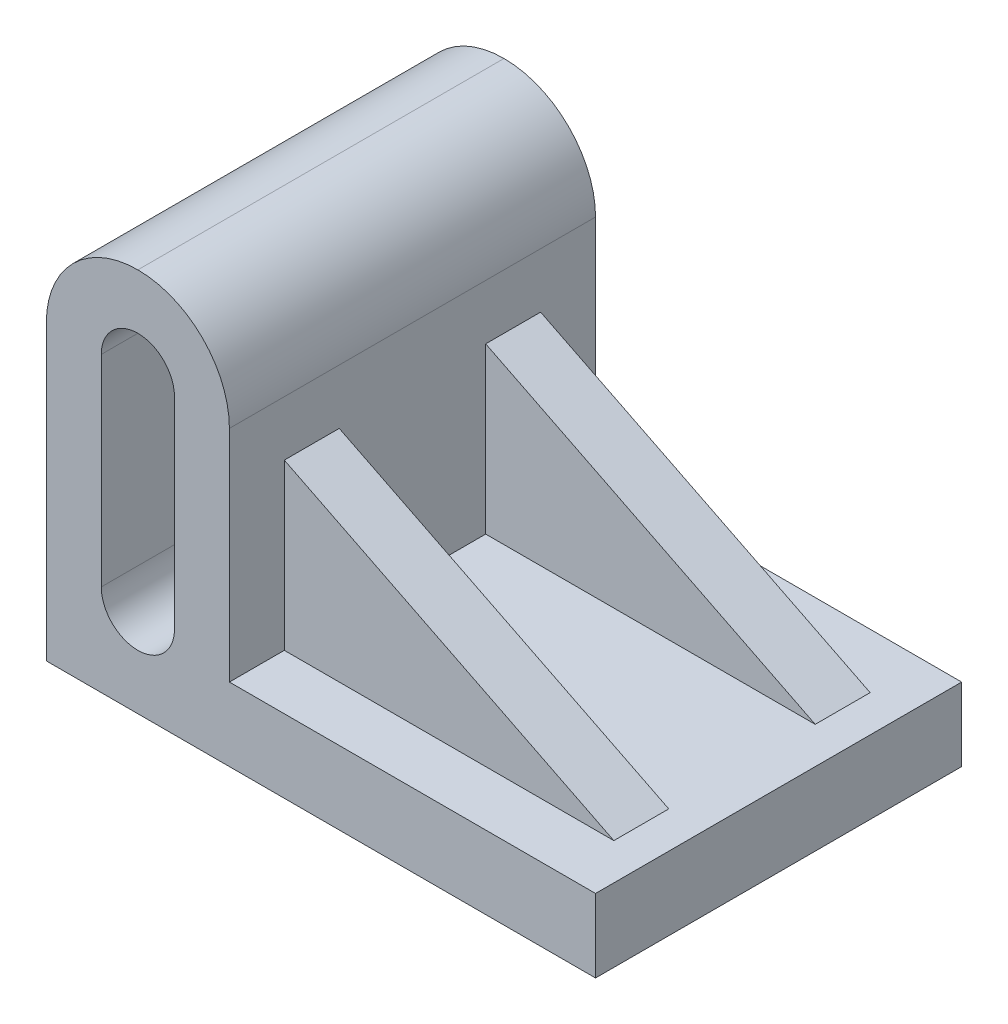
ISO-10303-21;
HEADER;
FILE_DESCRIPTION(('STEP AP214'),'2;1');
FILE_NAME('part.step','',(''),(''),'','','');
FILE_SCHEMA(('AUTOMOTIVE_DESIGN { 1 0 10303 214 1 1 1 1 }'));
ENDSEC;
DATA;
#1=APPLICATION_CONTEXT('core data for automotive mechanical design processes');
#2=APPLICATION_PROTOCOL_DEFINITION('international standard','automotive_design',2000,#1);
#3=PRODUCT_CONTEXT('',#1,'mechanical');
#4=PRODUCT('Part','Part','',(#3));
#5=PRODUCT_RELATED_PRODUCT_CATEGORY('part','',(#4));
#6=PRODUCT_DEFINITION_FORMATION('','',#4);
#7=PRODUCT_DEFINITION_CONTEXT('part definition',#1,'design');
#8=PRODUCT_DEFINITION('design','',#6,#7);
#9=PRODUCT_DEFINITION_SHAPE('','',#8);
#10=(LENGTH_UNIT() NAMED_UNIT(*) SI_UNIT(.MILLI.,.METRE.));
#11=(NAMED_UNIT(*) PLANE_ANGLE_UNIT() SI_UNIT($,.RADIAN.));
#12=(NAMED_UNIT(*) SI_UNIT($,.STERADIAN.) SOLID_ANGLE_UNIT());
#13=UNCERTAINTY_MEASURE_WITH_UNIT(LENGTH_MEASURE(1.E-05),#10,'distance_accuracy_value','');
#14=(GEOMETRIC_REPRESENTATION_CONTEXT(3) GLOBAL_UNCERTAINTY_ASSIGNED_CONTEXT((#13)) GLOBAL_UNIT_ASSIGNED_CONTEXT((#10,
#11,#12)) REPRESENTATION_CONTEXT('',''));
#15=CARTESIAN_POINT('',(0.,0.,0.));
#16=DIRECTION('',(0.,0.,1.));
#17=DIRECTION('',(1.,0.,0.));
#18=AXIS2_PLACEMENT_3D('',#15,#16,#17);
#19=CARTESIAN_POINT('',(150.,0.,-50.));
#20=DIRECTION('',(0.,-1.,0.));
#21=DIRECTION('',(0.,0.,-1.));
#22=AXIS2_PLACEMENT_3D('',#19,#20,#21);
#23=PLANE('',#22);
#24=DIRECTION('',(0.,0.,1.));
#25=VECTOR('',#24,1.);
#26=CARTESIAN_POINT('',(150.,0.,-50.));
#27=LINE('',#26,#25);
#28=CARTESIAN_POINT('',(150.,0.,-50.));
#29=VERTEX_POINT('',#28);
#30=CARTESIAN_POINT('',(150.,0.,50.));
#31=VERTEX_POINT('',#30);
#32=EDGE_CURVE('E210',#29,#31,#27,.T.);
#33=ORIENTED_EDGE('',*,*,#32,.T.);
#34=DIRECTION('',(1.,0.,0.));
#35=VECTOR('',#34,1.);
#36=CARTESIAN_POINT('',(150.,0.,50.));
#37=LINE('',#36,#35);
#38=CARTESIAN_POINT('',(0.,0.,50.));
#39=VERTEX_POINT('',#38);
#40=EDGE_CURVE('E279',#39,#31,#37,.T.);
#41=ORIENTED_EDGE('',*,*,#40,.F.);
#42=DIRECTION('',(0.,0.,1.));
#43=VECTOR('',#42,1.);
#44=CARTESIAN_POINT('',(0.,0.,-50.));
#45=LINE('',#44,#43);
#46=CARTESIAN_POINT('',(0.,0.,-50.));
#47=VERTEX_POINT('',#46);
#48=EDGE_CURVE('E193',#47,#39,#45,.T.);
#49=ORIENTED_EDGE('',*,*,#48,.F.);
#50=DIRECTION('',(1.,0.,0.));
#51=VECTOR('',#50,1.);
#52=CARTESIAN_POINT('',(150.,0.,-50.));
#53=LINE('',#52,#51);
#54=EDGE_CURVE('E264',#47,#29,#53,.T.);
#55=ORIENTED_EDGE('',*,*,#54,.T.);
#56=EDGE_LOOP('',(#33,#41,#49,#55));
#57=FACE_BOUND('',#56,.T.);
#58=ADVANCED_FACE('F45',(#57),#23,.T.);
#59=CARTESIAN_POINT('',(0.,0.,-50.));
#60=DIRECTION('',(-1.,0.,0.));
#61=DIRECTION('',(0.,0.,1.));
#62=AXIS2_PLACEMENT_3D('',#59,#60,#61);
#63=PLANE('',#62);
#64=DIRECTION('',(0.,-1.,0.));
#65=VECTOR('',#64,1.);
#66=CARTESIAN_POINT('',(0.,0.,50.));
#67=LINE('',#66,#65);
#68=CARTESIAN_POINT('',(0.,80.,50.));
#69=VERTEX_POINT('',#68);
#70=EDGE_CURVE('E268',#69,#39,#67,.T.);
#71=ORIENTED_EDGE('',*,*,#70,.F.);
#72=DIRECTION('',(0.,0.,1.));
#73=VECTOR('',#72,1.);
#74=CARTESIAN_POINT('',(0.,80.,-50.));
#75=LINE('',#74,#73);
#76=CARTESIAN_POINT('',(0.,80.,-50.));
#77=VERTEX_POINT('',#76);
#78=EDGE_CURVE('E225',#69,#77,#75,.F.);
#79=ORIENTED_EDGE('',*,*,#78,.T.);
#80=DIRECTION('',(0.,-1.,0.));
#81=VECTOR('',#80,1.);
#82=CARTESIAN_POINT('',(0.,0.,-50.));
#83=LINE('',#82,#81);
#84=EDGE_CURVE('E216',#77,#47,#83,.T.);
#85=ORIENTED_EDGE('',*,*,#84,.T.);
#86=ORIENTED_EDGE('',*,*,#48,.T.);
#87=EDGE_LOOP('',(#71,#79,#85,#86));
#88=FACE_BOUND('',#87,.T.);
#89=ADVANCED_FACE('F388',(#88),#63,.T.);
#90=CARTESIAN_POINT('',(50.,105.,-50.));
#91=DIRECTION('',(1.,0.,0.));
#92=DIRECTION('',(0.,1.,0.));
#93=AXIS2_PLACEMENT_3D('',#90,#91,#92);
#94=PLANE('',#93);
#95=DIRECTION('',(0.,1.,0.));
#96=VECTOR('',#95,1.);
#97=CARTESIAN_POINT('',(50.,20.,-35.));
#98=LINE('',#97,#96);
#99=CARTESIAN_POINT('',(50.,20.,-35.));
#100=VERTEX_POINT('',#99);
#101=CARTESIAN_POINT('',(50.,65.,-35.));
#102=VERTEX_POINT('',#101);
#103=EDGE_CURVE('E169',#100,#102,#98,.T.);
#104=ORIENTED_EDGE('',*,*,#103,.F.);
#105=DIRECTION('',(0.,0.,1.));
#106=VECTOR('',#105,1.);
#107=CARTESIAN_POINT('',(50.,20.,-50.));
#108=LINE('',#107,#106);
#109=CARTESIAN_POINT('',(50.,20.,-50.));
#110=VERTEX_POINT('',#109);
#111=EDGE_CURVE('E183',#110,#100,#108,.T.);
#112=ORIENTED_EDGE('',*,*,#111,.F.);
#113=DIRECTION('',(0.,1.,0.));
#114=VECTOR('',#113,1.);
#115=CARTESIAN_POINT('',(50.,105.,-50.));
#116=LINE('',#115,#114);
#117=CARTESIAN_POINT('',(50.,80.,-50.));
#118=VERTEX_POINT('',#117);
#119=EDGE_CURVE('E252',#110,#118,#116,.T.);
#120=ORIENTED_EDGE('',*,*,#119,.T.);
#121=DIRECTION('',(0.,0.,1.));
#122=VECTOR('',#121,1.);
#123=CARTESIAN_POINT('',(50.,80.,-50.));
#124=LINE('',#123,#122);
#125=CARTESIAN_POINT('',(50.,80.,50.));
#126=VERTEX_POINT('',#125);
#127=EDGE_CURVE('E231',#118,#126,#124,.T.);
#128=ORIENTED_EDGE('',*,*,#127,.T.);
#129=DIRECTION('',(0.,1.,0.));
#130=VECTOR('',#129,1.);
#131=CARTESIAN_POINT('',(50.,105.,50.));
#132=LINE('',#131,#130);
#133=CARTESIAN_POINT('',(50.,20.,50.));
#134=VERTEX_POINT('',#133);
#135=EDGE_CURVE('E241',#134,#126,#132,.T.);
#136=ORIENTED_EDGE('',*,*,#135,.F.);
#137=CARTESIAN_POINT('',(50.,20.,35.));
#138=VERTEX_POINT('',#137);
#139=EDGE_CURVE('E196',#138,#134,#108,.T.);
#140=ORIENTED_EDGE('',*,*,#139,.F.);
#141=DIRECTION('',(0.,-1.,0.));
#142=VECTOR('',#141,1.);
#143=CARTESIAN_POINT('',(50.,20.,35.));
#144=LINE('',#143,#142);
#145=CARTESIAN_POINT('',(50.,65.,35.));
#146=VERTEX_POINT('',#145);
#147=EDGE_CURVE('E337',#146,#138,#144,.T.);
#148=ORIENTED_EDGE('',*,*,#147,.F.);
#149=DIRECTION('',(0.,0.,-1.));
#150=VECTOR('',#149,1.);
#151=CARTESIAN_POINT('',(50.,65.,35.));
#152=LINE('',#151,#150);
#153=CARTESIAN_POINT('',(50.,65.,20.));
#154=VERTEX_POINT('',#153);
#155=EDGE_CURVE('E330',#146,#154,#152,.T.);
#156=ORIENTED_EDGE('',*,*,#155,.T.);
#157=DIRECTION('',(0.,-1.,0.));
#158=VECTOR('',#157,1.);
#159=CARTESIAN_POINT('',(50.,20.,20.));
#160=LINE('',#159,#158);
#161=CARTESIAN_POINT('',(50.,20.,20.));
#162=VERTEX_POINT('',#161);
#163=EDGE_CURVE('E342',#154,#162,#160,.T.);
#164=ORIENTED_EDGE('',*,*,#163,.T.);
#165=CARTESIAN_POINT('',(50.,20.,-20.));
#166=VERTEX_POINT('',#165);
#167=EDGE_CURVE('E194',#166,#162,#108,.T.);
#168=ORIENTED_EDGE('',*,*,#167,.F.);
#169=DIRECTION('',(0.,1.,0.));
#170=VECTOR('',#169,1.);
#171=CARTESIAN_POINT('',(50.,20.,-20.));
#172=LINE('',#171,#170);
#173=CARTESIAN_POINT('',(50.,65.,-20.));
#174=VERTEX_POINT('',#173);
#175=EDGE_CURVE('E61',#166,#174,#172,.T.);
#176=ORIENTED_EDGE('',*,*,#175,.T.);
#177=DIRECTION('',(0.,0.,1.));
#178=VECTOR('',#177,1.);
#179=CARTESIAN_POINT('',(50.,65.,-35.));
#180=LINE('',#179,#178);
#181=EDGE_CURVE('E185',#102,#174,#180,.T.);
#182=ORIENTED_EDGE('',*,*,#181,.F.);
#183=EDGE_LOOP('',(#104,#112,#120,#128,#136,#140,#148,#156,#164,#168,#176,#182));
#184=FACE_BOUND('',#183,.T.);
#185=ADVANCED_FACE('F181',(#184),#94,.T.);
#186=CARTESIAN_POINT('',(50.,20.,-50.));
#187=DIRECTION('',(0.,1.,0.));
#188=DIRECTION('',(0.,0.,1.));
#189=AXIS2_PLACEMENT_3D('',#186,#187,#188);
#190=PLANE('',#189);
#191=DIRECTION('',(-1.,0.,0.));
#192=VECTOR('',#191,1.);
#193=CARTESIAN_POINT('',(140.,20.,-35.));
#194=LINE('',#193,#192);
#195=CARTESIAN_POINT('',(140.,20.,-35.));
#196=VERTEX_POINT('',#195);
#197=EDGE_CURVE('E166',#196,#100,#194,.T.);
#198=ORIENTED_EDGE('',*,*,#197,.F.);
#199=DIRECTION('',(0.,0.,1.));
#200=VECTOR('',#199,1.);
#201=CARTESIAN_POINT('',(140.,20.,-35.));
#202=LINE('',#201,#200);
#203=CARTESIAN_POINT('',(140.,20.,-20.));
#204=VERTEX_POINT('',#203);
#205=EDGE_CURVE('E355',#196,#204,#202,.T.);
#206=ORIENTED_EDGE('',*,*,#205,.T.);
#207=DIRECTION('',(-1.,0.,0.));
#208=VECTOR('',#207,1.);
#209=CARTESIAN_POINT('',(140.,20.,-20.));
#210=LINE('',#209,#208);
#211=EDGE_CURVE('E362',#204,#166,#210,.T.);
#212=ORIENTED_EDGE('',*,*,#211,.T.);
#213=ORIENTED_EDGE('',*,*,#167,.T.);
#214=DIRECTION('',(1.,0.,0.));
#215=VECTOR('',#214,1.);
#216=CARTESIAN_POINT('',(140.,20.,20.));
#217=LINE('',#216,#215);
#218=CARTESIAN_POINT('',(140.,20.,20.));
#219=VERTEX_POINT('',#218);
#220=EDGE_CURVE('E338',#162,#219,#217,.T.);
#221=ORIENTED_EDGE('',*,*,#220,.T.);
#222=DIRECTION('',(0.,0.,-1.));
#223=VECTOR('',#222,1.);
#224=CARTESIAN_POINT('',(140.,20.,35.));
#225=LINE('',#224,#223);
#226=CARTESIAN_POINT('',(140.,20.,35.));
#227=VERTEX_POINT('',#226);
#228=EDGE_CURVE('E313',#227,#219,#225,.T.);
#229=ORIENTED_EDGE('',*,*,#228,.F.);
#230=DIRECTION('',(1.,0.,0.));
#231=VECTOR('',#230,1.);
#232=CARTESIAN_POINT('',(140.,20.,35.));
#233=LINE('',#232,#231);
#234=EDGE_CURVE('E348',#138,#227,#233,.T.);
#235=ORIENTED_EDGE('',*,*,#234,.F.);
#236=ORIENTED_EDGE('',*,*,#139,.T.);
#237=DIRECTION('',(-1.,0.,0.));
#238=VECTOR('',#237,1.);
#239=CARTESIAN_POINT('',(50.,20.,50.));
#240=LINE('',#239,#238);
#241=CARTESIAN_POINT('',(150.,20.,50.));
#242=VERTEX_POINT('',#241);
#243=EDGE_CURVE('E273',#242,#134,#240,.T.);
#244=ORIENTED_EDGE('',*,*,#243,.F.);
#245=DIRECTION('',(0.,0.,1.));
#246=VECTOR('',#245,1.);
#247=CARTESIAN_POINT('',(150.,20.,-50.));
#248=LINE('',#247,#246);
#249=CARTESIAN_POINT('',(150.,20.,-50.));
#250=VERTEX_POINT('',#249);
#251=EDGE_CURVE('E204',#250,#242,#248,.T.);
#252=ORIENTED_EDGE('',*,*,#251,.F.);
#253=DIRECTION('',(-1.,0.,0.));
#254=VECTOR('',#253,1.);
#255=CARTESIAN_POINT('',(50.,20.,-50.));
#256=LINE('',#255,#254);
#257=EDGE_CURVE('E191',#250,#110,#256,.T.);
#258=ORIENTED_EDGE('',*,*,#257,.T.);
#259=ORIENTED_EDGE('',*,*,#111,.T.);
#260=EDGE_LOOP('',(#198,#206,#212,#213,#221,#229,#235,#236,#244,#252,#258,#259));
#261=FACE_BOUND('',#260,.T.);
#262=ADVANCED_FACE('F189',(#261),#190,.T.);
#263=CARTESIAN_POINT('',(150.,20.,-50.));
#264=DIRECTION('',(1.,0.,0.));
#265=DIRECTION('',(0.,0.,-1.));
#266=AXIS2_PLACEMENT_3D('',#263,#264,#265);
#267=PLANE('',#266);
#268=ORIENTED_EDGE('',*,*,#251,.T.);
#269=DIRECTION('',(0.,1.,0.));
#270=VECTOR('',#269,1.);
#271=CARTESIAN_POINT('',(150.,20.,50.));
#272=LINE('',#271,#270);
#273=EDGE_CURVE('E276',#31,#242,#272,.T.);
#274=ORIENTED_EDGE('',*,*,#273,.F.);
#275=ORIENTED_EDGE('',*,*,#32,.F.);
#276=DIRECTION('',(0.,1.,0.));
#277=VECTOR('',#276,1.);
#278=CARTESIAN_POINT('',(150.,20.,-50.));
#279=LINE('',#278,#277);
#280=EDGE_CURVE('E259',#29,#250,#279,.T.);
#281=ORIENTED_EDGE('',*,*,#280,.T.);
#282=EDGE_LOOP('',(#268,#274,#275,#281));
#283=FACE_BOUND('',#282,.T.);
#284=ADVANCED_FACE('F398',(#283),#267,.T.);
#285=CARTESIAN_POINT('',(0.,0.,-50.));
#286=DIRECTION('',(0.,0.,-1.));
#287=DIRECTION('',(-1.,0.,0.));
#288=AXIS2_PLACEMENT_3D('',#285,#286,#287);
#289=PLANE('',#288);
#290=CARTESIAN_POINT('',(25.,80.,-50.));
#291=DIRECTION('',(0.,0.,1.));
#292=DIRECTION('',(1.,0.,0.));
#293=AXIS2_PLACEMENT_3D('',#290,#291,#292);
#294=CIRCLE('',#293,9.99999999999999);
#295=CARTESIAN_POINT('',(35.,80.,-50.));
#296=VERTEX_POINT('',#295);
#297=CARTESIAN_POINT('',(15.,80.,-50.));
#298=VERTEX_POINT('',#297);
#299=EDGE_CURVE('E301',#296,#298,#294,.T.);
#300=ORIENTED_EDGE('',*,*,#299,.T.);
#301=DIRECTION('',(0.,-1.,0.));
#302=VECTOR('',#301,1.);
#303=CARTESIAN_POINT('',(15.,80.,-50.));
#304=LINE('',#303,#302);
#305=CARTESIAN_POINT('',(15.,25.,-50.));
#306=VERTEX_POINT('',#305);
#307=EDGE_CURVE('E321',#298,#306,#304,.T.);
#308=ORIENTED_EDGE('',*,*,#307,.T.);
#309=CARTESIAN_POINT('',(25.,25.,-50.));
#310=DIRECTION('',(0.,0.,1.));
#311=DIRECTION('',(1.,0.,0.));
#312=AXIS2_PLACEMENT_3D('',#309,#310,#311);
#313=CIRCLE('',#312,9.99999999999999);
#314=CARTESIAN_POINT('',(35.,25.,-50.));
#315=VERTEX_POINT('',#314);
#316=EDGE_CURVE('E317',#306,#315,#313,.T.);
#317=ORIENTED_EDGE('',*,*,#316,.T.);
#318=DIRECTION('',(0.,1.,0.));
#319=VECTOR('',#318,1.);
#320=CARTESIAN_POINT('',(35.,80.,-50.));
#321=LINE('',#320,#319);
#322=EDGE_CURVE('E289',#315,#296,#321,.T.);
#323=ORIENTED_EDGE('',*,*,#322,.T.);
#324=EDGE_LOOP('',(#300,#308,#317,#323));
#325=FACE_BOUND('',#324,.T.);
#326=CARTESIAN_POINT('',(25.,80.,-50.));
#327=DIRECTION('',(0.,0.,-1.));
#328=DIRECTION('',(-1.,0.,0.));
#329=AXIS2_PLACEMENT_3D('',#326,#327,#328);
#330=CIRCLE('',#329,25.);
#331=CARTESIAN_POINT('',(25.,105.,-50.));
#332=VERTEX_POINT('',#331);
#333=EDGE_CURVE('E228',#77,#332,#330,.T.);
#334=ORIENTED_EDGE('',*,*,#333,.T.);
#335=CARTESIAN_POINT('',(25.,80.,-50.));
#336=DIRECTION('',(0.,0.,-1.));
#337=DIRECTION('',(-1.,0.,0.));
#338=AXIS2_PLACEMENT_3D('',#335,#336,#337);
#339=CIRCLE('',#338,25.);
#340=EDGE_CURVE('E11',#332,#118,#339,.T.);
#341=ORIENTED_EDGE('',*,*,#340,.T.);
#342=ORIENTED_EDGE('',*,*,#119,.F.);
#343=ORIENTED_EDGE('',*,*,#257,.F.);
#344=ORIENTED_EDGE('',*,*,#280,.F.);
#345=ORIENTED_EDGE('',*,*,#54,.F.);
#346=ORIENTED_EDGE('',*,*,#84,.F.);
#347=EDGE_LOOP('',(#334,#341,#342,#343,#344,#345,#346));
#348=FACE_BOUND('',#347,.T.);
#349=ADVANCED_FACE('F251',(#325,#348),#289,.T.);
#350=CARTESIAN_POINT('',(0.,0.,50.));
#351=DIRECTION('',(0.,0.,-1.));
#352=DIRECTION('',(-1.,0.,0.));
#353=AXIS2_PLACEMENT_3D('',#350,#351,#352);
#354=PLANE('',#353);
#355=DIRECTION('',(0.,-1.,0.));
#356=VECTOR('',#355,1.);
#357=CARTESIAN_POINT('',(15.,80.,50.));
#358=LINE('',#357,#356);
#359=CARTESIAN_POINT('',(15.,80.,50.));
#360=VERTEX_POINT('',#359);
#361=CARTESIAN_POINT('',(15.,25.,50.));
#362=VERTEX_POINT('',#361);
#363=EDGE_CURVE('E306',#360,#362,#358,.T.);
#364=ORIENTED_EDGE('',*,*,#363,.F.);
#365=CARTESIAN_POINT('',(25.,80.,50.));
#366=DIRECTION('',(0.,0.,1.));
#367=DIRECTION('',(1.,0.,0.));
#368=AXIS2_PLACEMENT_3D('',#365,#366,#367);
#369=CIRCLE('',#368,9.99999999999999);
#370=CARTESIAN_POINT('',(35.,80.,50.));
#371=VERTEX_POINT('',#370);
#372=EDGE_CURVE('E310',#371,#360,#369,.T.);
#373=ORIENTED_EDGE('',*,*,#372,.F.);
#374=DIRECTION('',(0.,1.,0.));
#375=VECTOR('',#374,1.);
#376=CARTESIAN_POINT('',(35.,80.,50.));
#377=LINE('',#376,#375);
#378=CARTESIAN_POINT('',(35.,25.,50.));
#379=VERTEX_POINT('',#378);
#380=EDGE_CURVE('E297',#379,#371,#377,.T.);
#381=ORIENTED_EDGE('',*,*,#380,.F.);
#382=CARTESIAN_POINT('',(25.,25.,50.));
#383=DIRECTION('',(0.,0.,1.));
#384=DIRECTION('',(1.,0.,0.));
#385=AXIS2_PLACEMENT_3D('',#382,#383,#384);
#386=CIRCLE('',#385,9.99999999999999);
#387=EDGE_CURVE('E302',#362,#379,#386,.T.);
#388=ORIENTED_EDGE('',*,*,#387,.F.);
#389=EDGE_LOOP('',(#364,#373,#381,#388));
#390=FACE_BOUND('',#389,.T.);
#391=ORIENTED_EDGE('',*,*,#135,.T.);
#392=CARTESIAN_POINT('',(25.,80.,50.));
#393=DIRECTION('',(0.,0.,-1.));
#394=DIRECTION('',(-1.,0.,0.));
#395=AXIS2_PLACEMENT_3D('',#392,#393,#394);
#396=CIRCLE('',#395,25.);
#397=CARTESIAN_POINT('',(25.,105.,50.));
#398=VERTEX_POINT('',#397);
#399=EDGE_CURVE('E54',#126,#398,#396,.F.);
#400=ORIENTED_EDGE('',*,*,#399,.T.);
#401=CARTESIAN_POINT('',(25.,80.,50.));
#402=DIRECTION('',(0.,0.,-1.));
#403=DIRECTION('',(-1.,0.,0.));
#404=AXIS2_PLACEMENT_3D('',#401,#402,#403);
#405=CIRCLE('',#404,25.);
#406=EDGE_CURVE('E222',#398,#69,#405,.F.);
#407=ORIENTED_EDGE('',*,*,#406,.T.);
#408=ORIENTED_EDGE('',*,*,#70,.T.);
#409=ORIENTED_EDGE('',*,*,#40,.T.);
#410=ORIENTED_EDGE('',*,*,#273,.T.);
#411=ORIENTED_EDGE('',*,*,#243,.T.);
#412=EDGE_LOOP('',(#391,#400,#407,#408,#409,#410,#411));
#413=FACE_BOUND('',#412,.T.);
#414=ADVANCED_FACE('F238',(#390,#413),#354,.F.);
#415=CARTESIAN_POINT('',(25.,80.,-50.));
#416=DIRECTION('',(0.,0.,1.));
#417=DIRECTION('',(1.,0.,0.));
#418=AXIS2_PLACEMENT_3D('',#415,#416,#417);
#419=CYLINDRICAL_SURFACE('',#418,25.);
#420=ORIENTED_EDGE('',*,*,#333,.F.);
#421=ORIENTED_EDGE('',*,*,#78,.F.);
#422=ORIENTED_EDGE('',*,*,#406,.F.);
#423=DIRECTION('',(0.,0.,1.));
#424=VECTOR('',#423,1.);
#425=CARTESIAN_POINT('',(25.,105.,-50.));
#426=LINE('',#425,#424);
#427=EDGE_CURVE('E200',#332,#398,#426,.T.);
#428=ORIENTED_EDGE('',*,*,#427,.F.);
#429=EDGE_LOOP('',(#420,#421,#422,#428));
#430=FACE_BOUND('',#429,.T.);
#431=ADVANCED_FACE('F248',(#430),#419,.T.);
#432=CARTESIAN_POINT('',(25.,80.,-50.));
#433=DIRECTION('',(0.,0.,1.));
#434=DIRECTION('',(1.,0.,0.));
#435=AXIS2_PLACEMENT_3D('',#432,#433,#434);
#436=CYLINDRICAL_SURFACE('',#435,25.);
#437=ORIENTED_EDGE('',*,*,#340,.F.);
#438=ORIENTED_EDGE('',*,*,#427,.T.);
#439=ORIENTED_EDGE('',*,*,#399,.F.);
#440=ORIENTED_EDGE('',*,*,#127,.F.);
#441=EDGE_LOOP('',(#437,#438,#439,#440));
#442=FACE_BOUND('',#441,.T.);
#443=ADVANCED_FACE('F47',(#442),#436,.T.);
#444=CARTESIAN_POINT('',(25.,80.,-50.));
#445=DIRECTION('',(0.,0.,1.));
#446=DIRECTION('',(1.,0.,0.));
#447=AXIS2_PLACEMENT_3D('',#444,#445,#446);
#448=CYLINDRICAL_SURFACE('',#447,9.99999999999999);
#449=ORIENTED_EDGE('',*,*,#372,.T.);
#450=DIRECTION('',(0.,0.,1.));
#451=VECTOR('',#450,1.);
#452=CARTESIAN_POINT('',(15.,80.,-50.));
#453=LINE('',#452,#451);
#454=EDGE_CURVE('E284',#298,#360,#453,.T.);
#455=ORIENTED_EDGE('',*,*,#454,.F.);
#456=ORIENTED_EDGE('',*,*,#299,.F.);
#457=DIRECTION('',(0.,0.,1.));
#458=VECTOR('',#457,1.);
#459=CARTESIAN_POINT('',(35.,80.,-50.));
#460=LINE('',#459,#458);
#461=EDGE_CURVE('E283',#296,#371,#460,.T.);
#462=ORIENTED_EDGE('',*,*,#461,.T.);
#463=EDGE_LOOP('',(#449,#455,#456,#462));
#464=FACE_BOUND('',#463,.T.);
#465=ADVANCED_FACE('F404',(#464),#448,.F.);
#466=CARTESIAN_POINT('',(35.,80.,-50.));
#467=DIRECTION('',(1.,0.,0.));
#468=DIRECTION('',(0.,0.,-1.));
#469=AXIS2_PLACEMENT_3D('',#466,#467,#468);
#470=PLANE('',#469);
#471=ORIENTED_EDGE('',*,*,#380,.T.);
#472=ORIENTED_EDGE('',*,*,#461,.F.);
#473=ORIENTED_EDGE('',*,*,#322,.F.);
#474=DIRECTION('',(0.,0.,1.));
#475=VECTOR('',#474,1.);
#476=CARTESIAN_POINT('',(35.,25.,-50.));
#477=LINE('',#476,#475);
#478=EDGE_CURVE('E292',#315,#379,#477,.T.);
#479=ORIENTED_EDGE('',*,*,#478,.T.);
#480=EDGE_LOOP('',(#471,#472,#473,#479));
#481=FACE_BOUND('',#480,.T.);
#482=ADVANCED_FACE('F470',(#481),#470,.F.);
#483=CARTESIAN_POINT('',(25.,25.,-50.));
#484=DIRECTION('',(0.,0.,1.));
#485=DIRECTION('',(1.,0.,0.));
#486=AXIS2_PLACEMENT_3D('',#483,#484,#485);
#487=CYLINDRICAL_SURFACE('',#486,9.99999999999999);
#488=ORIENTED_EDGE('',*,*,#387,.T.);
#489=ORIENTED_EDGE('',*,*,#478,.F.);
#490=ORIENTED_EDGE('',*,*,#316,.F.);
#491=DIRECTION('',(0.,0.,1.));
#492=VECTOR('',#491,1.);
#493=CARTESIAN_POINT('',(15.,25.,-50.));
#494=LINE('',#493,#492);
#495=EDGE_CURVE('E288',#306,#362,#494,.T.);
#496=ORIENTED_EDGE('',*,*,#495,.T.);
#497=EDGE_LOOP('',(#488,#489,#490,#496));
#498=FACE_BOUND('',#497,.T.);
#499=ADVANCED_FACE('F478',(#498),#487,.F.);
#500=CARTESIAN_POINT('',(15.,80.,-50.));
#501=DIRECTION('',(-1.,0.,0.));
#502=DIRECTION('',(0.,-1.,0.));
#503=AXIS2_PLACEMENT_3D('',#500,#501,#502);
#504=PLANE('',#503);
#505=ORIENTED_EDGE('',*,*,#363,.T.);
#506=ORIENTED_EDGE('',*,*,#495,.F.);
#507=ORIENTED_EDGE('',*,*,#307,.F.);
#508=ORIENTED_EDGE('',*,*,#454,.T.);
#509=EDGE_LOOP('',(#505,#506,#507,#508));
#510=FACE_BOUND('',#509,.T.);
#511=ADVANCED_FACE('F384',(#510),#504,.F.);
#512=CARTESIAN_POINT('',(50.,65.,35.));
#513=DIRECTION('',(-0.447213595499958,-0.894427190999916,0.));
#514=DIRECTION('',(0.894427190999916,-0.447213595499958,0.));
#515=AXIS2_PLACEMENT_3D('',#512,#513,#514);
#516=PLANE('',#515);
#517=DIRECTION('',(-0.894427190999916,0.447213595499958,0.));
#518=VECTOR('',#517,1.);
#519=CARTESIAN_POINT('',(50.,65.,20.));
#520=LINE('',#519,#518);
#521=EDGE_CURVE('E69',#219,#154,#520,.T.);
#522=ORIENTED_EDGE('',*,*,#521,.T.);
#523=ORIENTED_EDGE('',*,*,#155,.F.);
#524=DIRECTION('',(-0.894427190999916,0.447213595499958,0.));
#525=VECTOR('',#524,1.);
#526=CARTESIAN_POINT('',(50.,65.,35.));
#527=LINE('',#526,#525);
#528=EDGE_CURVE('E334',#227,#146,#527,.T.);
#529=ORIENTED_EDGE('',*,*,#528,.F.);
#530=ORIENTED_EDGE('',*,*,#228,.T.);
#531=EDGE_LOOP('',(#522,#523,#529,#530));
#532=FACE_BOUND('',#531,.T.);
#533=ADVANCED_FACE('F373',(#532),#516,.F.);
#534=CARTESIAN_POINT('',(0.,0.,35.));
#535=DIRECTION('',(0.,0.,1.));
#536=DIRECTION('',(1.,0.,0.));
#537=AXIS2_PLACEMENT_3D('',#534,#535,#536);
#538=PLANE('',#537);
#539=ORIENTED_EDGE('',*,*,#147,.T.);
#540=ORIENTED_EDGE('',*,*,#234,.T.);
#541=ORIENTED_EDGE('',*,*,#528,.T.);
#542=EDGE_LOOP('',(#539,#540,#541));
#543=FACE_BOUND('',#542,.T.);
#544=ADVANCED_FACE('F375',(#543),#538,.T.);
#545=CARTESIAN_POINT('',(0.,0.,20.));
#546=DIRECTION('',(0.,0.,1.));
#547=DIRECTION('',(1.,0.,0.));
#548=AXIS2_PLACEMENT_3D('',#545,#546,#547);
#549=PLANE('',#548);
#550=ORIENTED_EDGE('',*,*,#163,.F.);
#551=ORIENTED_EDGE('',*,*,#521,.F.);
#552=ORIENTED_EDGE('',*,*,#220,.F.);
#553=EDGE_LOOP('',(#550,#551,#552));
#554=FACE_BOUND('',#553,.T.);
#555=ADVANCED_FACE('F369',(#554),#549,.F.);
#556=CARTESIAN_POINT('',(50.,65.,-35.));
#557=DIRECTION('',(-0.447213595499958,-0.894427190999916,0.));
#558=DIRECTION('',(0.894427190999916,-0.447213595499958,0.));
#559=AXIS2_PLACEMENT_3D('',#556,#557,#558);
#560=PLANE('',#559);
#561=DIRECTION('',(0.894427190999916,-0.447213595499958,0.));
#562=VECTOR('',#561,1.);
#563=CARTESIAN_POINT('',(50.,65.,-20.));
#564=LINE('',#563,#562);
#565=EDGE_CURVE('E177',#174,#204,#564,.T.);
#566=ORIENTED_EDGE('',*,*,#565,.T.);
#567=ORIENTED_EDGE('',*,*,#205,.F.);
#568=DIRECTION('',(0.894427190999916,-0.447213595499958,0.));
#569=VECTOR('',#568,1.);
#570=CARTESIAN_POINT('',(50.,65.,-35.));
#571=LINE('',#570,#569);
#572=EDGE_CURVE('E171',#102,#196,#571,.T.);
#573=ORIENTED_EDGE('',*,*,#572,.F.);
#574=ORIENTED_EDGE('',*,*,#181,.T.);
#575=EDGE_LOOP('',(#566,#567,#573,#574));
#576=FACE_BOUND('',#575,.T.);
#577=ADVANCED_FACE('F382',(#576),#560,.F.);
#578=CARTESIAN_POINT('',(0.,0.,-35.));
#579=DIRECTION('',(0.,0.,-1.));
#580=DIRECTION('',(-1.,0.,0.));
#581=AXIS2_PLACEMENT_3D('',#578,#579,#580);
#582=PLANE('',#581);
#583=ORIENTED_EDGE('',*,*,#197,.T.);
#584=ORIENTED_EDGE('',*,*,#103,.T.);
#585=ORIENTED_EDGE('',*,*,#572,.T.);
#586=EDGE_LOOP('',(#583,#584,#585));
#587=FACE_BOUND('',#586,.T.);
#588=ADVANCED_FACE('F168',(#587),#582,.T.);
#589=CARTESIAN_POINT('',(0.,0.,-20.));
#590=DIRECTION('',(0.,0.,-1.));
#591=DIRECTION('',(-1.,0.,0.));
#592=AXIS2_PLACEMENT_3D('',#589,#590,#591);
#593=PLANE('',#592);
#594=ORIENTED_EDGE('',*,*,#211,.F.);
#595=ORIENTED_EDGE('',*,*,#565,.F.);
#596=ORIENTED_EDGE('',*,*,#175,.F.);
#597=EDGE_LOOP('',(#594,#595,#596));
#598=FACE_BOUND('',#597,.T.);
#599=ADVANCED_FACE('F522',(#598),#593,.F.);
#600=CLOSED_SHELL('',(#58,#89,#185,#262,#284,#349,#414,#431,#443,#465,#482,#499,#511,#533,#544,
#555,#577,#588,#599));
#601=MANIFOLD_SOLID_BREP('B2',#600);
#602=ADVANCED_BREP_SHAPE_REPRESENTATION('',(#18,#601),#14);
#603=SHAPE_DEFINITION_REPRESENTATION(#9,#602);
ENDSEC;
END-ISO-10303-21;
